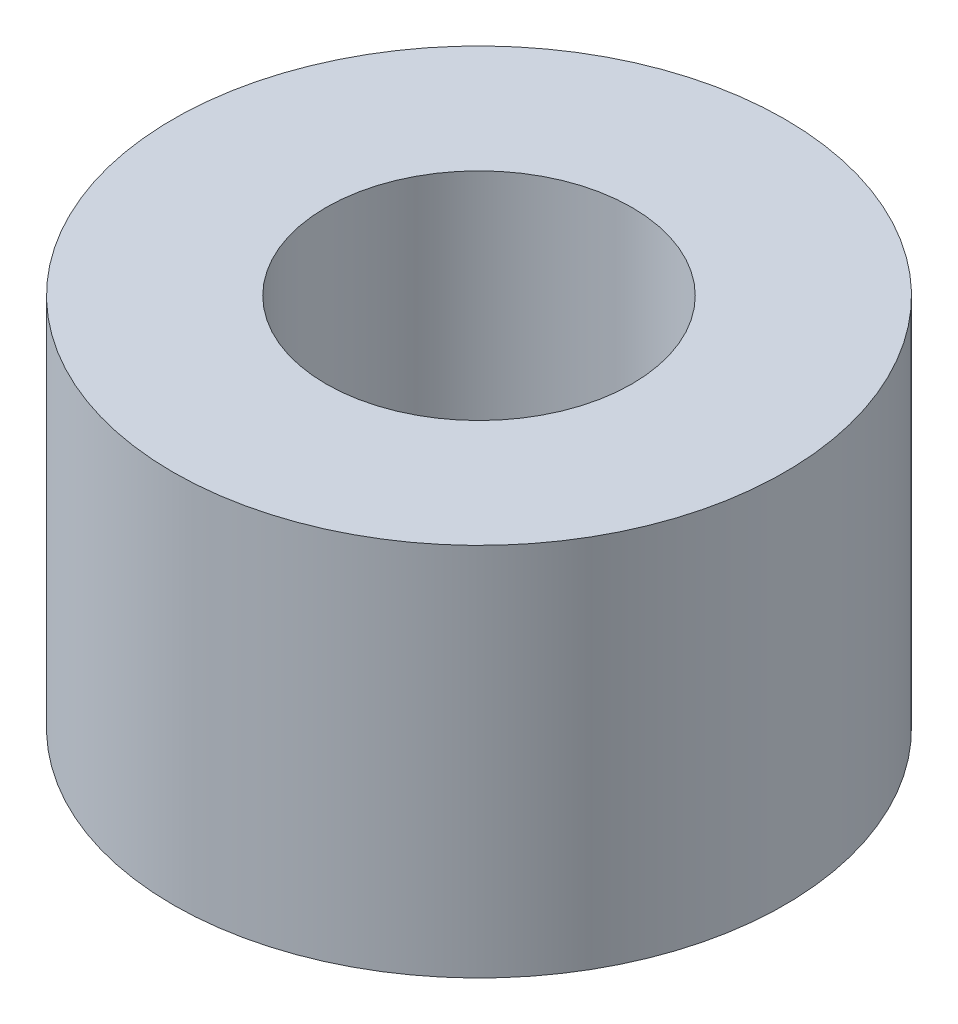
ISO-10303-21;
HEADER;
FILE_DESCRIPTION(('STEP AP214'),'2;1');
FILE_NAME('part.step','',(''),(''),'','','');
FILE_SCHEMA(('AUTOMOTIVE_DESIGN { 1 0 10303 214 1 1 1 1 }'));
ENDSEC;
DATA;
#1=APPLICATION_CONTEXT('core data for automotive mechanical design processes');
#2=APPLICATION_PROTOCOL_DEFINITION('international standard','automotive_design',2000,#1);
#3=PRODUCT_CONTEXT('',#1,'mechanical');
#4=PRODUCT('Part','Part','',(#3));
#5=PRODUCT_RELATED_PRODUCT_CATEGORY('part','',(#4));
#6=PRODUCT_DEFINITION_FORMATION('','',#4);
#7=PRODUCT_DEFINITION_CONTEXT('part definition',#1,'design');
#8=PRODUCT_DEFINITION('design','',#6,#7);
#9=PRODUCT_DEFINITION_SHAPE('','',#8);
#10=(LENGTH_UNIT() NAMED_UNIT(*) SI_UNIT(.MILLI.,.METRE.));
#11=(NAMED_UNIT(*) PLANE_ANGLE_UNIT() SI_UNIT($,.RADIAN.));
#12=(NAMED_UNIT(*) SI_UNIT($,.STERADIAN.) SOLID_ANGLE_UNIT());
#13=UNCERTAINTY_MEASURE_WITH_UNIT(LENGTH_MEASURE(1.E-05),#10,'distance_accuracy_value','');
#14=(GEOMETRIC_REPRESENTATION_CONTEXT(3) GLOBAL_UNCERTAINTY_ASSIGNED_CONTEXT((#13)) GLOBAL_UNIT_ASSIGNED_CONTEXT((#10,
#11,#12)) REPRESENTATION_CONTEXT('',''));
#15=CARTESIAN_POINT('',(0.,0.,0.));
#16=DIRECTION('',(0.,0.,1.));
#17=DIRECTION('',(1.,0.,0.));
#18=AXIS2_PLACEMENT_3D('',#15,#16,#17);
#19=CARTESIAN_POINT('',(0.,31.115,0.));
#20=DIRECTION('',(0.,-1.,0.));
#21=DIRECTION('',(0.,0.,-1.));
#22=AXIS2_PLACEMENT_3D('',#19,#20,#21);
#23=CYLINDRICAL_SURFACE('',#22,25.4);
#24=CARTESIAN_POINT('',(0.,31.115,0.));
#25=DIRECTION('',(0.,1.,0.));
#26=DIRECTION('',(0.,0.,1.));
#27=AXIS2_PLACEMENT_3D('',#24,#25,#26);
#28=CIRCLE('',#27,25.4);
#29=CARTESIAN_POINT('',(0.,31.115,-25.4));
#30=VERTEX_POINT('',#29);
#31=EDGE_CURVE('E10',#30,#30,#28,.T.);
#32=CARTESIAN_POINT('',(0.,0.,0.));
#33=DIRECTION('',(0.,1.,0.));
#34=DIRECTION('',(0.,0.,1.));
#35=AXIS2_PLACEMENT_3D('',#32,#33,#34);
#36=CIRCLE('',#35,25.4);
#37=CARTESIAN_POINT('',(0.,0.,-25.4));
#38=VERTEX_POINT('',#37);
#39=EDGE_CURVE('E38',#38,#38,#36,.T.);
#40=CARTESIAN_POINT('',(0.,31.115,-25.4));
#41=CARTESIAN_POINT('',(0.,30.7908854166667,-25.4));
#42=CARTESIAN_POINT('',(0.,30.4667708333333,-25.4));
#43=CARTESIAN_POINT('',(0.,29.8185416666667,-25.4));
#44=CARTESIAN_POINT('',(0.,29.4944270833333,-25.4));
#45=CARTESIAN_POINT('',(0.,28.8461979166667,-25.4));
#46=CARTESIAN_POINT('',(0.,28.5220833333333,-25.4));
#47=CARTESIAN_POINT('',(0.,27.8738541666667,-25.4));
#48=CARTESIAN_POINT('',(0.,27.5497395833333,-25.4));
#49=CARTESIAN_POINT('',(0.,26.9015104166667,-25.4));
#50=CARTESIAN_POINT('',(0.,26.5773958333333,-25.4));
#51=CARTESIAN_POINT('',(0.,25.9291666666667,-25.4));
#52=CARTESIAN_POINT('',(0.,25.6050520833333,-25.4));
#53=CARTESIAN_POINT('',(0.,24.9568229166667,-25.4));
#54=CARTESIAN_POINT('',(0.,24.6327083333333,-25.4));
#55=CARTESIAN_POINT('',(0.,23.9844791666667,-25.4));
#56=CARTESIAN_POINT('',(0.,23.6603645833333,-25.4));
#57=CARTESIAN_POINT('',(0.,23.0121354166667,-25.4));
#58=CARTESIAN_POINT('',(0.,22.6880208333333,-25.4));
#59=CARTESIAN_POINT('',(0.,22.0397916666667,-25.4));
#60=CARTESIAN_POINT('',(0.,21.7156770833333,-25.4));
#61=CARTESIAN_POINT('',(0.,21.0674479166667,-25.4));
#62=CARTESIAN_POINT('',(0.,20.7433333333333,-25.4));
#63=CARTESIAN_POINT('',(0.,20.0951041666667,-25.4));
#64=CARTESIAN_POINT('',(0.,19.7709895833333,-25.4));
#65=CARTESIAN_POINT('',(0.,19.1227604166667,-25.4));
#66=CARTESIAN_POINT('',(0.,18.7986458333333,-25.4));
#67=CARTESIAN_POINT('',(0.,18.1504166666667,-25.4));
#68=CARTESIAN_POINT('',(0.,17.8263020833333,-25.4));
#69=CARTESIAN_POINT('',(0.,17.1780729166667,-25.4));
#70=CARTESIAN_POINT('',(0.,16.8539583333333,-25.4));
#71=CARTESIAN_POINT('',(0.,16.2057291666667,-25.4));
#72=CARTESIAN_POINT('',(0.,15.8816145833333,-25.4));
#73=CARTESIAN_POINT('',(0.,15.2333854166667,-25.4));
#74=CARTESIAN_POINT('',(0.,14.9092708333333,-25.4));
#75=CARTESIAN_POINT('',(0.,14.2610416666667,-25.4));
#76=CARTESIAN_POINT('',(0.,13.9369270833333,-25.4));
#77=CARTESIAN_POINT('',(0.,13.2886979166667,-25.4));
#78=CARTESIAN_POINT('',(0.,12.9645833333333,-25.4));
#79=CARTESIAN_POINT('',(0.,12.3163541666667,-25.4));
#80=CARTESIAN_POINT('',(0.,11.9922395833333,-25.4));
#81=CARTESIAN_POINT('',(0.,11.3440104166667,-25.4));
#82=CARTESIAN_POINT('',(0.,11.0198958333333,-25.4));
#83=CARTESIAN_POINT('',(0.,10.3716666666667,-25.4));
#84=CARTESIAN_POINT('',(0.,10.0475520833333,-25.4));
#85=CARTESIAN_POINT('',(0.,9.39932291666667,-25.4));
#86=CARTESIAN_POINT('',(0.,9.07520833333333,-25.4));
#87=CARTESIAN_POINT('',(0.,8.42697916666667,-25.4));
#88=CARTESIAN_POINT('',(0.,8.10286458333333,-25.4));
#89=CARTESIAN_POINT('',(0.,7.45463541666667,-25.4));
#90=CARTESIAN_POINT('',(0.,7.13052083333333,-25.4));
#91=CARTESIAN_POINT('',(0.,6.48229166666667,-25.4));
#92=CARTESIAN_POINT('',(0.,6.15817708333333,-25.4));
#93=CARTESIAN_POINT('',(0.,5.50994791666667,-25.4));
#94=CARTESIAN_POINT('',(0.,5.18583333333333,-25.4));
#95=CARTESIAN_POINT('',(0.,4.53760416666667,-25.4));
#96=CARTESIAN_POINT('',(0.,4.21348958333333,-25.4));
#97=CARTESIAN_POINT('',(0.,3.56526041666667,-25.4));
#98=CARTESIAN_POINT('',(0.,3.24114583333333,-25.4));
#99=CARTESIAN_POINT('',(0.,2.59291666666667,-25.4));
#100=CARTESIAN_POINT('',(0.,2.26880208333333,-25.4));
#101=CARTESIAN_POINT('',(0.,1.62057291666667,-25.4));
#102=CARTESIAN_POINT('',(0.,1.29645833333333,-25.4));
#103=CARTESIAN_POINT('',(0.,0.648229166666667,-25.4));
#104=CARTESIAN_POINT('',(0.,0.324114583333333,-25.4));
#105=CARTESIAN_POINT('',(0.,0.,-25.4));
#106=B_SPLINE_CURVE_WITH_KNOTS('',3,(#40,#41,#42,#43,#44,#45,#46,#47,#48,#49,#50,#51,#52,#53,
#54,#55,#56,#57,#58,#59,#60,#61,#62,#63,#64,#65,#66,#67,#68,#69,#70,#71,#72,#73,#74,#75,#76,#77,
#78,#79,#80,#81,#82,#83,#84,#85,#86,#87,#88,#89,#90,#91,#92,#93,#94,#95,#96,#97,#98,#99,#100,
#101,#102,#103,#104,#105),.UNSPECIFIED.,.F.,.F.,(4,2,2,2,2,2,2,2,2,2,2,2,2,2,2,2,2,2,2,2,2,2,2,
2,2,2,2,2,2,2,2,2,4),(0.,0.97234375,1.9446875,2.91703125,3.889375,4.86171875,5.8340625,
6.80640625,7.77875,8.75109375,9.7234375,10.69578125,11.668125,12.64046875,13.6128125,
14.58515625,15.5575,16.52984375,17.5021875,18.47453125,19.446875,20.41921875,21.3915625,
22.36390625,23.33625,24.30859375,25.2809375,26.25328125,27.225625,28.19796875,29.1703125,
30.14265625,31.115),.UNSPECIFIED.);
#107=EDGE_CURVE('BSEAM35',#30,#38,#106,.T.);
#108=ORIENTED_EDGE('',*,*,#31,.F.);
#109=ORIENTED_EDGE('',*,*,#39,.T.);
#110=ORIENTED_EDGE('',*,*,#107,.T.);
#111=ORIENTED_EDGE('',*,*,#107,.F.);
#112=EDGE_LOOP('',(#108,#110,#109,#111));
#113=FACE_BOUND('',#112,.T.);
#114=ADVANCED_FACE('F35',(#113),#23,.T.);
#115=CARTESIAN_POINT('',(0.,31.115,0.));
#116=DIRECTION('',(0.,1.,0.));
#117=DIRECTION('',(0.,0.,1.));
#118=AXIS2_PLACEMENT_3D('',#115,#116,#117);
#119=PLANE('',#118);
#120=CARTESIAN_POINT('',(0.,31.115,0.));
#121=DIRECTION('',(0.,1.,0.));
#122=DIRECTION('',(0.,0.,1.));
#123=AXIS2_PLACEMENT_3D('',#120,#121,#122);
#124=CIRCLE('',#123,12.7);
#125=CARTESIAN_POINT('',(0.,31.115,12.7));
#126=VERTEX_POINT('',#125);
#127=EDGE_CURVE('E47',#126,#126,#124,.T.);
#128=ORIENTED_EDGE('',*,*,#127,.F.);
#129=EDGE_LOOP('',(#128));
#130=FACE_BOUND('',#129,.T.);
#131=ORIENTED_EDGE('',*,*,#31,.T.);
#132=EDGE_LOOP('',(#131));
#133=FACE_BOUND('',#132,.T.);
#134=ADVANCED_FACE('F62',(#130,#133),#119,.T.);
#135=CARTESIAN_POINT('',(0.,0.,0.));
#136=DIRECTION('',(0.,1.,0.));
#137=DIRECTION('',(0.,0.,1.));
#138=AXIS2_PLACEMENT_3D('',#135,#136,#137);
#139=PLANE('',#138);
#140=CARTESIAN_POINT('',(0.,0.,0.));
#141=DIRECTION('',(0.,1.,0.));
#142=DIRECTION('',(0.,0.,1.));
#143=AXIS2_PLACEMENT_3D('',#140,#141,#142);
#144=CIRCLE('',#143,12.7);
#145=CARTESIAN_POINT('',(0.,0.,12.7));
#146=VERTEX_POINT('',#145);
#147=EDGE_CURVE('E45',#146,#146,#144,.T.);
#148=ORIENTED_EDGE('',*,*,#147,.T.);
#149=EDGE_LOOP('',(#148));
#150=FACE_BOUND('',#149,.T.);
#151=ORIENTED_EDGE('',*,*,#39,.F.);
#152=EDGE_LOOP('',(#151));
#153=FACE_BOUND('',#152,.T.);
#154=ADVANCED_FACE('F53',(#150,#153),#139,.F.);
#155=CARTESIAN_POINT('',(0.,0.,0.));
#156=DIRECTION('',(0.,1.,0.));
#157=DIRECTION('',(0.,0.,1.));
#158=AXIS2_PLACEMENT_3D('',#155,#156,#157);
#159=CYLINDRICAL_SURFACE('',#158,12.7);
#160=CARTESIAN_POINT('',(0.,0.,12.7));
#161=CARTESIAN_POINT('',(0.,0.324114583333333,12.7));
#162=CARTESIAN_POINT('',(0.,0.648229166666667,12.7));
#163=CARTESIAN_POINT('',(0.,1.29645833333333,12.7));
#164=CARTESIAN_POINT('',(0.,1.62057291666667,12.7));
#165=CARTESIAN_POINT('',(0.,2.26880208333333,12.7));
#166=CARTESIAN_POINT('',(0.,2.59291666666667,12.7));
#167=CARTESIAN_POINT('',(0.,3.24114583333333,12.7));
#168=CARTESIAN_POINT('',(0.,3.56526041666667,12.7));
#169=CARTESIAN_POINT('',(0.,4.21348958333333,12.7));
#170=CARTESIAN_POINT('',(0.,4.53760416666667,12.7));
#171=CARTESIAN_POINT('',(0.,5.18583333333333,12.7));
#172=CARTESIAN_POINT('',(0.,5.50994791666667,12.7));
#173=CARTESIAN_POINT('',(0.,6.15817708333333,12.7));
#174=CARTESIAN_POINT('',(0.,6.48229166666667,12.7));
#175=CARTESIAN_POINT('',(0.,7.13052083333333,12.7));
#176=CARTESIAN_POINT('',(0.,7.45463541666667,12.7));
#177=CARTESIAN_POINT('',(0.,8.10286458333333,12.7));
#178=CARTESIAN_POINT('',(0.,8.42697916666667,12.7));
#179=CARTESIAN_POINT('',(0.,9.07520833333333,12.7));
#180=CARTESIAN_POINT('',(0.,9.39932291666667,12.7));
#181=CARTESIAN_POINT('',(0.,10.0475520833333,12.7));
#182=CARTESIAN_POINT('',(0.,10.3716666666667,12.7));
#183=CARTESIAN_POINT('',(0.,11.0198958333333,12.7));
#184=CARTESIAN_POINT('',(0.,11.3440104166667,12.7));
#185=CARTESIAN_POINT('',(0.,11.9922395833333,12.7));
#186=CARTESIAN_POINT('',(0.,12.3163541666667,12.7));
#187=CARTESIAN_POINT('',(0.,12.9645833333333,12.7));
#188=CARTESIAN_POINT('',(0.,13.2886979166667,12.7));
#189=CARTESIAN_POINT('',(0.,13.9369270833333,12.7));
#190=CARTESIAN_POINT('',(0.,14.2610416666667,12.7));
#191=CARTESIAN_POINT('',(0.,14.9092708333333,12.7));
#192=CARTESIAN_POINT('',(0.,15.2333854166667,12.7));
#193=CARTESIAN_POINT('',(0.,15.8816145833333,12.7));
#194=CARTESIAN_POINT('',(0.,16.2057291666667,12.7));
#195=CARTESIAN_POINT('',(0.,16.8539583333333,12.7));
#196=CARTESIAN_POINT('',(0.,17.1780729166667,12.7));
#197=CARTESIAN_POINT('',(0.,17.8263020833333,12.7));
#198=CARTESIAN_POINT('',(0.,18.1504166666667,12.7));
#199=CARTESIAN_POINT('',(0.,18.7986458333333,12.7));
#200=CARTESIAN_POINT('',(0.,19.1227604166667,12.7));
#201=CARTESIAN_POINT('',(0.,19.7709895833333,12.7));
#202=CARTESIAN_POINT('',(0.,20.0951041666667,12.7));
#203=CARTESIAN_POINT('',(0.,20.7433333333333,12.7));
#204=CARTESIAN_POINT('',(0.,21.0674479166667,12.7));
#205=CARTESIAN_POINT('',(0.,21.7156770833333,12.7));
#206=CARTESIAN_POINT('',(0.,22.0397916666667,12.7));
#207=CARTESIAN_POINT('',(0.,22.6880208333333,12.7));
#208=CARTESIAN_POINT('',(0.,23.0121354166667,12.7));
#209=CARTESIAN_POINT('',(0.,23.6603645833333,12.7));
#210=CARTESIAN_POINT('',(0.,23.9844791666667,12.7));
#211=CARTESIAN_POINT('',(0.,24.6327083333333,12.7));
#212=CARTESIAN_POINT('',(0.,24.9568229166667,12.7));
#213=CARTESIAN_POINT('',(0.,25.6050520833333,12.7));
#214=CARTESIAN_POINT('',(0.,25.9291666666667,12.7));
#215=CARTESIAN_POINT('',(0.,26.5773958333333,12.7));
#216=CARTESIAN_POINT('',(0.,26.9015104166667,12.7));
#217=CARTESIAN_POINT('',(0.,27.5497395833333,12.7));
#218=CARTESIAN_POINT('',(0.,27.8738541666667,12.7));
#219=CARTESIAN_POINT('',(0.,28.5220833333333,12.7));
#220=CARTESIAN_POINT('',(0.,28.8461979166667,12.7));
#221=CARTESIAN_POINT('',(0.,29.4944270833333,12.7));
#222=CARTESIAN_POINT('',(0.,29.8185416666667,12.7));
#223=CARTESIAN_POINT('',(0.,30.4667708333333,12.7));
#224=CARTESIAN_POINT('',(0.,30.7908854166667,12.7));
#225=CARTESIAN_POINT('',(0.,31.115,12.7));
#226=B_SPLINE_CURVE_WITH_KNOTS('',3,(#160,#161,#162,#163,#164,#165,#166,#167,#168,#169,#170,
#171,#172,#173,#174,#175,#176,#177,#178,#179,#180,#181,#182,#183,#184,#185,#186,#187,#188,#189,
#190,#191,#192,#193,#194,#195,#196,#197,#198,#199,#200,#201,#202,#203,#204,#205,#206,#207,#208,
#209,#210,#211,#212,#213,#214,#215,#216,#217,#218,#219,#220,#221,#222,#223,#224,#225),
.UNSPECIFIED.,.F.,.F.,(4,2,2,2,2,2,2,2,2,2,2,2,2,2,2,2,2,2,2,2,2,2,2,2,2,2,2,2,2,2,2,2,4),(0.,
0.97234375,1.9446875,2.91703125,3.889375,4.86171875,5.8340625,6.80640625,7.77875,8.75109375,
9.7234375,10.69578125,11.668125,12.64046875,13.6128125,14.58515625,15.5575,16.52984375,
17.5021875,18.47453125,19.446875,20.41921875,21.3915625,22.36390625,23.33625,24.30859375,
25.2809375,26.25328125,27.225625,28.19796875,29.1703125,30.14265625,31.115),.UNSPECIFIED.);
#227=EDGE_CURVE('BSEAM56',#146,#126,#226,.T.);
#228=ORIENTED_EDGE('',*,*,#147,.F.);
#229=ORIENTED_EDGE('',*,*,#127,.T.);
#230=ORIENTED_EDGE('',*,*,#227,.T.);
#231=ORIENTED_EDGE('',*,*,#227,.F.);
#232=EDGE_LOOP('',(#228,#230,#229,#231));
#233=FACE_BOUND('',#232,.T.);
#234=ADVANCED_FACE('F56',(#233),#159,.F.);
#235=CLOSED_SHELL('',(#114,#134,#154,#234));
#236=MANIFOLD_SOLID_BREP('B2',#235);
#237=ADVANCED_BREP_SHAPE_REPRESENTATION('',(#18,#236),#14);
#238=SHAPE_DEFINITION_REPRESENTATION(#9,#237);
ENDSEC;
END-ISO-10303-21;
